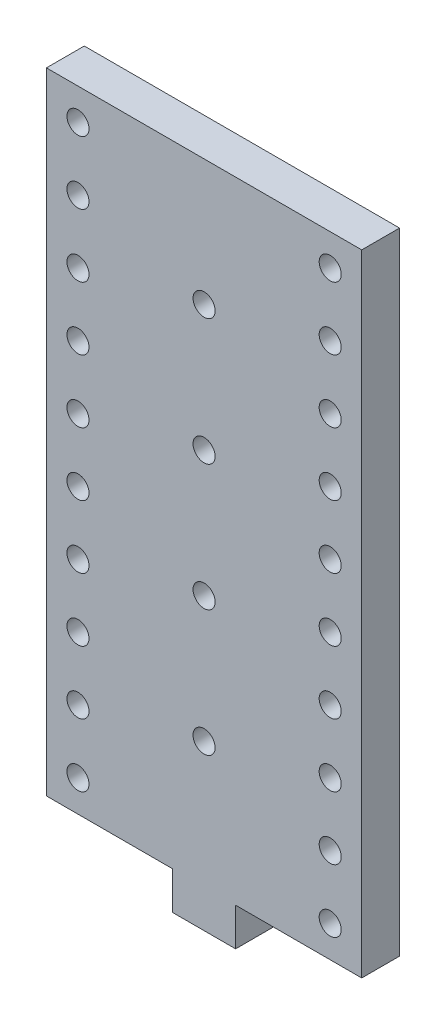
ISO-10303-21;
HEADER;
FILE_DESCRIPTION(('STEP AP214'),'2;1');
FILE_NAME('part.step','',(''),(''),'','','');
FILE_SCHEMA(('AUTOMOTIVE_DESIGN { 1 0 10303 214 1 1 1 1 }'));
ENDSEC;
DATA;
#1=APPLICATION_CONTEXT('core data for automotive mechanical design processes');
#2=APPLICATION_PROTOCOL_DEFINITION('international standard','automotive_design',2000,#1);
#3=PRODUCT_CONTEXT('',#1,'mechanical');
#4=PRODUCT('Part','Part','',(#3));
#5=PRODUCT_RELATED_PRODUCT_CATEGORY('part','',(#4));
#6=PRODUCT_DEFINITION_FORMATION('','',#4);
#7=PRODUCT_DEFINITION_CONTEXT('part definition',#1,'design');
#8=PRODUCT_DEFINITION('design','',#6,#7);
#9=PRODUCT_DEFINITION_SHAPE('','',#8);
#10=(LENGTH_UNIT() NAMED_UNIT(*) SI_UNIT(.MILLI.,.METRE.));
#11=(NAMED_UNIT(*) PLANE_ANGLE_UNIT() SI_UNIT($,.RADIAN.));
#12=(NAMED_UNIT(*) SI_UNIT($,.STERADIAN.) SOLID_ANGLE_UNIT());
#13=UNCERTAINTY_MEASURE_WITH_UNIT(LENGTH_MEASURE(1.E-05),#10,'distance_accuracy_value','');
#14=(GEOMETRIC_REPRESENTATION_CONTEXT(3) GLOBAL_UNCERTAINTY_ASSIGNED_CONTEXT((#13)) GLOBAL_UNIT_ASSIGNED_CONTEXT((#10,
#11,#12)) REPRESENTATION_CONTEXT('',''));
#15=CARTESIAN_POINT('',(0.,0.,0.));
#16=DIRECTION('',(0.,0.,1.));
#17=DIRECTION('',(1.,0.,0.));
#18=AXIS2_PLACEMENT_3D('',#15,#16,#17);
#19=CARTESIAN_POINT('',(20.6383027209334,0.,6.));
#20=DIRECTION('',(0.,1.,0.));
#21=DIRECTION('',(-1.,0.,0.));
#22=AXIS2_PLACEMENT_3D('',#19,#20,#21);
#23=PLANE('',#22);
#24=DIRECTION('',(0.,0.,-1.));
#25=VECTOR('',#24,1.);
#26=CARTESIAN_POINT('',(-9.36169727906661,0.,6.));
#27=LINE('',#26,#25);
#28=CARTESIAN_POINT('',(-9.36169727906661,0.,6.));
#29=VERTEX_POINT('',#28);
#30=CARTESIAN_POINT('',(-9.36169727906661,0.,0.));
#31=VERTEX_POINT('',#30);
#32=EDGE_CURVE('E57',#29,#31,#27,.T.);
#33=ORIENTED_EDGE('',*,*,#32,.F.);
#34=DIRECTION('',(1.,0.,0.));
#35=VECTOR('',#34,1.);
#36=CARTESIAN_POINT('',(20.6383027209334,0.,6.));
#37=LINE('',#36,#35);
#38=CARTESIAN_POINT('',(-29.3616972790666,0.,6.));
#39=VERTEX_POINT('',#38);
#40=EDGE_CURVE('E345',#39,#29,#37,.T.);
#41=ORIENTED_EDGE('',*,*,#40,.F.);
#42=DIRECTION('',(0.,0.,-1.));
#43=VECTOR('',#42,1.);
#44=CARTESIAN_POINT('',(-29.3616972790666,0.,6.));
#45=LINE('',#44,#43);
#46=CARTESIAN_POINT('',(-29.3616972790666,0.,0.));
#47=VERTEX_POINT('',#46);
#48=EDGE_CURVE('E364',#39,#47,#45,.T.);
#49=ORIENTED_EDGE('',*,*,#48,.T.);
#50=DIRECTION('',(1.,0.,0.));
#51=VECTOR('',#50,1.);
#52=CARTESIAN_POINT('',(20.6383027209334,0.,0.));
#53=LINE('',#52,#51);
#54=EDGE_CURVE('E338',#47,#31,#53,.T.);
#55=ORIENTED_EDGE('',*,*,#54,.T.);
#56=EDGE_LOOP('',(#33,#41,#49,#55));
#57=FACE_BOUND('',#56,.T.);
#58=ADVANCED_FACE('F41',(#57),#23,.F.);
#59=DIRECTION('',(0.,0.,1.));
#60=VECTOR('',#59,1.);
#61=CARTESIAN_POINT('',(0.638302720933393,0.,6.));
#62=LINE('',#61,#60);
#63=CARTESIAN_POINT('',(0.638302720933393,0.,0.));
#64=VERTEX_POINT('',#63);
#65=CARTESIAN_POINT('',(0.638302720933393,0.,6.));
#66=VERTEX_POINT('',#65);
#67=EDGE_CURVE('E65',#64,#66,#62,.T.);
#68=ORIENTED_EDGE('',*,*,#67,.F.);
#69=CARTESIAN_POINT('',(20.6383027209334,0.,0.));
#70=VERTEX_POINT('',#69);
#71=EDGE_CURVE('E358',#64,#70,#53,.T.);
#72=ORIENTED_EDGE('',*,*,#71,.T.);
#73=DIRECTION('',(0.,0.,-1.));
#74=VECTOR('',#73,1.);
#75=CARTESIAN_POINT('',(20.6383027209334,0.,6.));
#76=LINE('',#75,#74);
#77=CARTESIAN_POINT('',(20.6383027209334,0.,6.));
#78=VERTEX_POINT('',#77);
#79=EDGE_CURVE('E348',#78,#70,#76,.T.);
#80=ORIENTED_EDGE('',*,*,#79,.F.);
#81=EDGE_CURVE('E344',#66,#78,#37,.T.);
#82=ORIENTED_EDGE('',*,*,#81,.F.);
#83=EDGE_LOOP('',(#68,#72,#80,#82));
#84=FACE_BOUND('',#83,.T.);
#85=ADVANCED_FACE('F398',(#84),#23,.F.);
#86=CARTESIAN_POINT('',(20.6383027209334,0.,6.));
#87=DIRECTION('',(-1.,0.,0.));
#88=DIRECTION('',(0.,0.,1.));
#89=AXIS2_PLACEMENT_3D('',#86,#87,#88);
#90=PLANE('',#89);
#91=DIRECTION('',(0.,1.,0.));
#92=VECTOR('',#91,1.);
#93=CARTESIAN_POINT('',(20.6383027209334,0.,0.));
#94=LINE('',#93,#92);
#95=CARTESIAN_POINT('',(20.6383027209334,100.,0.));
#96=VERTEX_POINT('',#95);
#97=EDGE_CURVE('E332',#70,#96,#94,.T.);
#98=ORIENTED_EDGE('',*,*,#97,.T.);
#99=DIRECTION('',(0.,0.,-1.));
#100=VECTOR('',#99,1.);
#101=CARTESIAN_POINT('',(20.6383027209334,100.,6.));
#102=LINE('',#101,#100);
#103=CARTESIAN_POINT('',(20.6383027209334,100.,6.));
#104=VERTEX_POINT('',#103);
#105=EDGE_CURVE('E11',#104,#96,#102,.T.);
#106=ORIENTED_EDGE('',*,*,#105,.F.);
#107=DIRECTION('',(0.,1.,0.));
#108=VECTOR('',#107,1.);
#109=CARTESIAN_POINT('',(20.6383027209334,0.,6.));
#110=LINE('',#109,#108);
#111=EDGE_CURVE('E333',#78,#104,#110,.T.);
#112=ORIENTED_EDGE('',*,*,#111,.F.);
#113=ORIENTED_EDGE('',*,*,#79,.T.);
#114=EDGE_LOOP('',(#98,#106,#112,#113));
#115=FACE_BOUND('',#114,.T.);
#116=ADVANCED_FACE('F43',(#115),#90,.F.);
#117=CARTESIAN_POINT('',(20.6383027209334,100.,6.));
#118=DIRECTION('',(0.,-1.,0.));
#119=DIRECTION('',(0.,0.,-1.));
#120=AXIS2_PLACEMENT_3D('',#117,#118,#119);
#121=PLANE('',#120);
#122=DIRECTION('',(-1.,0.,0.));
#123=VECTOR('',#122,1.);
#124=CARTESIAN_POINT('',(20.6383027209334,100.,0.));
#125=LINE('',#124,#123);
#126=CARTESIAN_POINT('',(-29.3616972790666,100.,0.));
#127=VERTEX_POINT('',#126);
#128=EDGE_CURVE('E352',#96,#127,#125,.T.);
#129=ORIENTED_EDGE('',*,*,#128,.T.);
#130=DIRECTION('',(0.,0.,-1.));
#131=VECTOR('',#130,1.);
#132=CARTESIAN_POINT('',(-29.3616972790666,100.,6.));
#133=LINE('',#132,#131);
#134=CARTESIAN_POINT('',(-29.3616972790666,100.,6.));
#135=VERTEX_POINT('',#134);
#136=EDGE_CURVE('E50',#135,#127,#133,.T.);
#137=ORIENTED_EDGE('',*,*,#136,.F.);
#138=DIRECTION('',(-1.,0.,0.));
#139=VECTOR('',#138,1.);
#140=CARTESIAN_POINT('',(20.6383027209334,100.,6.));
#141=LINE('',#140,#139);
#142=EDGE_CURVE('E337',#104,#135,#141,.T.);
#143=ORIENTED_EDGE('',*,*,#142,.F.);
#144=ORIENTED_EDGE('',*,*,#105,.T.);
#145=EDGE_LOOP('',(#129,#137,#143,#144));
#146=FACE_BOUND('',#145,.T.);
#147=ADVANCED_FACE('F400',(#146),#121,.F.);
#148=CARTESIAN_POINT('',(-29.3616972790666,0.,6.));
#149=DIRECTION('',(1.,0.,0.));
#150=DIRECTION('',(0.,0.,-1.));
#151=AXIS2_PLACEMENT_3D('',#148,#149,#150);
#152=PLANE('',#151);
#153=DIRECTION('',(0.,-1.,0.));
#154=VECTOR('',#153,1.);
#155=CARTESIAN_POINT('',(-29.3616972790666,0.,0.));
#156=LINE('',#155,#154);
#157=EDGE_CURVE('E355',#127,#47,#156,.T.);
#158=ORIENTED_EDGE('',*,*,#157,.T.);
#159=ORIENTED_EDGE('',*,*,#48,.F.);
#160=DIRECTION('',(0.,-1.,0.));
#161=VECTOR('',#160,1.);
#162=CARTESIAN_POINT('',(-29.3616972790666,0.,6.));
#163=LINE('',#162,#161);
#164=EDGE_CURVE('E341',#135,#39,#163,.T.);
#165=ORIENTED_EDGE('',*,*,#164,.F.);
#166=ORIENTED_EDGE('',*,*,#136,.T.);
#167=EDGE_LOOP('',(#158,#159,#165,#166));
#168=FACE_BOUND('',#167,.T.);
#169=ADVANCED_FACE('F373',(#168),#152,.F.);
#170=CARTESIAN_POINT('',(0.,0.,6.));
#171=DIRECTION('',(0.,0.,1.));
#172=DIRECTION('',(1.,0.,0.));
#173=AXIS2_PLACEMENT_3D('',#170,#171,#172);
#174=PLANE('',#173);
#175=CARTESIAN_POINT('',(-4.3616972790666,20.,6.));
#176=DIRECTION('',(0.,0.,1.));
#177=DIRECTION('',(1.,0.,0.));
#178=AXIS2_PLACEMENT_3D('',#175,#176,#177);
#179=CIRCLE('',#178,1.75);
#180=CARTESIAN_POINT('',(-2.6116972790666,20.,6.));
#181=VERTEX_POINT('',#180);
#182=EDGE_CURVE('E134',#181,#181,#179,.T.);
#183=ORIENTED_EDGE('',*,*,#182,.F.);
#184=EDGE_LOOP('',(#183));
#185=FACE_BOUND('',#184,.T.);
#186=CARTESIAN_POINT('',(-4.3616972790666,60.,6.));
#187=DIRECTION('',(0.,0.,1.));
#188=DIRECTION('',(1.,0.,0.));
#189=AXIS2_PLACEMENT_3D('',#186,#187,#188);
#190=CIRCLE('',#189,1.75);
#191=CARTESIAN_POINT('',(-2.6116972790666,60.,6.));
#192=VERTEX_POINT('',#191);
#193=EDGE_CURVE('E158',#192,#192,#190,.T.);
#194=ORIENTED_EDGE('',*,*,#193,.F.);
#195=EDGE_LOOP('',(#194));
#196=FACE_BOUND('',#195,.T.);
#197=CARTESIAN_POINT('',(-4.3616972790666,80.,6.));
#198=DIRECTION('',(0.,0.,1.));
#199=DIRECTION('',(1.,0.,0.));
#200=AXIS2_PLACEMENT_3D('',#197,#198,#199);
#201=CIRCLE('',#200,1.75);
#202=CARTESIAN_POINT('',(-2.6116972790666,80.,6.));
#203=VERTEX_POINT('',#202);
#204=EDGE_CURVE('E150',#203,#203,#201,.T.);
#205=ORIENTED_EDGE('',*,*,#204,.F.);
#206=EDGE_LOOP('',(#205));
#207=FACE_BOUND('',#206,.T.);
#208=CARTESIAN_POINT('',(-4.3616972790666,40.,6.));
#209=DIRECTION('',(0.,0.,1.));
#210=DIRECTION('',(1.,0.,0.));
#211=AXIS2_PLACEMENT_3D('',#208,#209,#210);
#212=CIRCLE('',#211,1.75);
#213=CARTESIAN_POINT('',(-2.6116972790666,40.,6.));
#214=VERTEX_POINT('',#213);
#215=EDGE_CURVE('E149',#214,#214,#212,.T.);
#216=ORIENTED_EDGE('',*,*,#215,.F.);
#217=EDGE_LOOP('',(#216));
#218=FACE_BOUND('',#217,.T.);
#219=CARTESIAN_POINT('',(15.6383027209334,75.,6.));
#220=DIRECTION('',(0.,0.,1.));
#221=DIRECTION('',(1.,0.,0.));
#222=AXIS2_PLACEMENT_3D('',#219,#220,#221);
#223=CIRCLE('',#222,1.75);
#224=CARTESIAN_POINT('',(17.3883027209334,75.,6.));
#225=VERTEX_POINT('',#224);
#226=EDGE_CURVE('E328',#225,#225,#223,.T.);
#227=ORIENTED_EDGE('',*,*,#226,.F.);
#228=EDGE_LOOP('',(#227));
#229=FACE_BOUND('',#228,.T.);
#230=CARTESIAN_POINT('',(15.6383027209334,85.,6.));
#231=DIRECTION('',(0.,0.,1.));
#232=DIRECTION('',(1.,0.,0.));
#233=AXIS2_PLACEMENT_3D('',#230,#231,#232);
#234=CIRCLE('',#233,1.75);
#235=CARTESIAN_POINT('',(17.3883027209334,85.,6.));
#236=VERTEX_POINT('',#235);
#237=EDGE_CURVE('E324',#236,#236,#234,.T.);
#238=ORIENTED_EDGE('',*,*,#237,.F.);
#239=EDGE_LOOP('',(#238));
#240=FACE_BOUND('',#239,.T.);
#241=CARTESIAN_POINT('',(15.6383027209334,95.,6.));
#242=DIRECTION('',(0.,0.,1.));
#243=DIRECTION('',(1.,0.,0.));
#244=AXIS2_PLACEMENT_3D('',#241,#242,#243);
#245=CIRCLE('',#244,1.75);
#246=CARTESIAN_POINT('',(17.3883027209334,95.,6.));
#247=VERTEX_POINT('',#246);
#248=EDGE_CURVE('E320',#247,#247,#245,.T.);
#249=ORIENTED_EDGE('',*,*,#248,.F.);
#250=EDGE_LOOP('',(#249));
#251=FACE_BOUND('',#250,.T.);
#252=CARTESIAN_POINT('',(-24.3616972790666,4.99999999999999,6.));
#253=DIRECTION('',(0.,0.,1.));
#254=DIRECTION('',(1.,0.,0.));
#255=AXIS2_PLACEMENT_3D('',#252,#253,#254);
#256=CIRCLE('',#255,1.75);
#257=CARTESIAN_POINT('',(-22.6116972790666,4.99999999999999,6.));
#258=VERTEX_POINT('',#257);
#259=EDGE_CURVE('E316',#258,#258,#256,.T.);
#260=ORIENTED_EDGE('',*,*,#259,.F.);
#261=EDGE_LOOP('',(#260));
#262=FACE_BOUND('',#261,.T.);
#263=CARTESIAN_POINT('',(15.6383027209334,65.,6.));
#264=DIRECTION('',(0.,0.,1.));
#265=DIRECTION('',(1.,0.,0.));
#266=AXIS2_PLACEMENT_3D('',#263,#264,#265);
#267=CIRCLE('',#266,1.75);
#268=CARTESIAN_POINT('',(17.3883027209334,65.,6.));
#269=VERTEX_POINT('',#268);
#270=EDGE_CURVE('E312',#269,#269,#267,.T.);
#271=ORIENTED_EDGE('',*,*,#270,.F.);
#272=EDGE_LOOP('',(#271));
#273=FACE_BOUND('',#272,.T.);
#274=CARTESIAN_POINT('',(15.6383027209334,55.,6.));
#275=DIRECTION('',(0.,0.,1.));
#276=DIRECTION('',(1.,0.,0.));
#277=AXIS2_PLACEMENT_3D('',#274,#275,#276);
#278=CIRCLE('',#277,1.75);
#279=CARTESIAN_POINT('',(17.3883027209334,55.,6.));
#280=VERTEX_POINT('',#279);
#281=EDGE_CURVE('E308',#280,#280,#278,.T.);
#282=ORIENTED_EDGE('',*,*,#281,.F.);
#283=EDGE_LOOP('',(#282));
#284=FACE_BOUND('',#283,.T.);
#285=CARTESIAN_POINT('',(15.6383027209334,45.,6.));
#286=DIRECTION('',(0.,0.,1.));
#287=DIRECTION('',(1.,0.,0.));
#288=AXIS2_PLACEMENT_3D('',#285,#286,#287);
#289=CIRCLE('',#288,1.75);
#290=CARTESIAN_POINT('',(17.3883027209334,45.,6.));
#291=VERTEX_POINT('',#290);
#292=EDGE_CURVE('E304',#291,#291,#289,.T.);
#293=ORIENTED_EDGE('',*,*,#292,.F.);
#294=EDGE_LOOP('',(#293));
#295=FACE_BOUND('',#294,.T.);
#296=CARTESIAN_POINT('',(15.6383027209334,35.,6.));
#297=DIRECTION('',(0.,0.,1.));
#298=DIRECTION('',(1.,0.,0.));
#299=AXIS2_PLACEMENT_3D('',#296,#297,#298);
#300=CIRCLE('',#299,1.75);
#301=CARTESIAN_POINT('',(17.3883027209334,35.,6.));
#302=VERTEX_POINT('',#301);
#303=EDGE_CURVE('E300',#302,#302,#300,.T.);
#304=ORIENTED_EDGE('',*,*,#303,.F.);
#305=EDGE_LOOP('',(#304));
#306=FACE_BOUND('',#305,.T.);
#307=CARTESIAN_POINT('',(-24.3616972790666,15.,6.));
#308=DIRECTION('',(0.,0.,1.));
#309=DIRECTION('',(1.,0.,0.));
#310=AXIS2_PLACEMENT_3D('',#307,#308,#309);
#311=CIRCLE('',#310,1.75);
#312=CARTESIAN_POINT('',(-22.6116972790666,15.,6.));
#313=VERTEX_POINT('',#312);
#314=EDGE_CURVE('E296',#313,#313,#311,.T.);
#315=ORIENTED_EDGE('',*,*,#314,.F.);
#316=EDGE_LOOP('',(#315));
#317=FACE_BOUND('',#316,.T.);
#318=CARTESIAN_POINT('',(-24.3616972790666,25.,6.));
#319=DIRECTION('',(0.,0.,1.));
#320=DIRECTION('',(1.,0.,0.));
#321=AXIS2_PLACEMENT_3D('',#318,#319,#320);
#322=CIRCLE('',#321,1.75);
#323=CARTESIAN_POINT('',(-22.6116972790666,25.,6.));
#324=VERTEX_POINT('',#323);
#325=EDGE_CURVE('E292',#324,#324,#322,.T.);
#326=ORIENTED_EDGE('',*,*,#325,.F.);
#327=EDGE_LOOP('',(#326));
#328=FACE_BOUND('',#327,.T.);
#329=CARTESIAN_POINT('',(-24.3616972790666,35.,6.));
#330=DIRECTION('',(0.,0.,1.));
#331=DIRECTION('',(1.,0.,0.));
#332=AXIS2_PLACEMENT_3D('',#329,#330,#331);
#333=CIRCLE('',#332,1.75);
#334=CARTESIAN_POINT('',(-22.6116972790666,35.,6.));
#335=VERTEX_POINT('',#334);
#336=EDGE_CURVE('E288',#335,#335,#333,.T.);
#337=ORIENTED_EDGE('',*,*,#336,.F.);
#338=EDGE_LOOP('',(#337));
#339=FACE_BOUND('',#338,.T.);
#340=CARTESIAN_POINT('',(-24.3616972790666,45.,6.));
#341=DIRECTION('',(0.,0.,1.));
#342=DIRECTION('',(1.,0.,0.));
#343=AXIS2_PLACEMENT_3D('',#340,#341,#342);
#344=CIRCLE('',#343,1.75);
#345=CARTESIAN_POINT('',(-22.6116972790666,45.,6.));
#346=VERTEX_POINT('',#345);
#347=EDGE_CURVE('E284',#346,#346,#344,.T.);
#348=ORIENTED_EDGE('',*,*,#347,.F.);
#349=EDGE_LOOP('',(#348));
#350=FACE_BOUND('',#349,.T.);
#351=CARTESIAN_POINT('',(-24.3616972790666,55.,6.));
#352=DIRECTION('',(0.,0.,1.));
#353=DIRECTION('',(1.,0.,0.));
#354=AXIS2_PLACEMENT_3D('',#351,#352,#353);
#355=CIRCLE('',#354,1.75);
#356=CARTESIAN_POINT('',(-22.6116972790666,55.,6.));
#357=VERTEX_POINT('',#356);
#358=EDGE_CURVE('E280',#357,#357,#355,.T.);
#359=ORIENTED_EDGE('',*,*,#358,.F.);
#360=EDGE_LOOP('',(#359));
#361=FACE_BOUND('',#360,.T.);
#362=CARTESIAN_POINT('',(-24.3616972790666,65.,6.));
#363=DIRECTION('',(0.,0.,1.));
#364=DIRECTION('',(1.,0.,0.));
#365=AXIS2_PLACEMENT_3D('',#362,#363,#364);
#366=CIRCLE('',#365,1.75);
#367=CARTESIAN_POINT('',(-22.6116972790666,65.,6.));
#368=VERTEX_POINT('',#367);
#369=EDGE_CURVE('E276',#368,#368,#366,.T.);
#370=ORIENTED_EDGE('',*,*,#369,.F.);
#371=EDGE_LOOP('',(#370));
#372=FACE_BOUND('',#371,.T.);
#373=CARTESIAN_POINT('',(-24.3616972790666,75.,6.));
#374=DIRECTION('',(0.,0.,1.));
#375=DIRECTION('',(1.,0.,0.));
#376=AXIS2_PLACEMENT_3D('',#373,#374,#375);
#377=CIRCLE('',#376,1.75);
#378=CARTESIAN_POINT('',(-22.6116972790666,75.,6.));
#379=VERTEX_POINT('',#378);
#380=EDGE_CURVE('E272',#379,#379,#377,.T.);
#381=ORIENTED_EDGE('',*,*,#380,.F.);
#382=EDGE_LOOP('',(#381));
#383=FACE_BOUND('',#382,.T.);
#384=CARTESIAN_POINT('',(-24.3616972790666,85.,6.));
#385=DIRECTION('',(0.,0.,1.));
#386=DIRECTION('',(1.,0.,0.));
#387=AXIS2_PLACEMENT_3D('',#384,#385,#386);
#388=CIRCLE('',#387,1.75);
#389=CARTESIAN_POINT('',(-22.6116972790666,85.,6.));
#390=VERTEX_POINT('',#389);
#391=EDGE_CURVE('E268',#390,#390,#388,.T.);
#392=ORIENTED_EDGE('',*,*,#391,.F.);
#393=EDGE_LOOP('',(#392));
#394=FACE_BOUND('',#393,.T.);
#395=CARTESIAN_POINT('',(15.6383027209334,25.,6.));
#396=DIRECTION('',(0.,0.,1.));
#397=DIRECTION('',(1.,0.,0.));
#398=AXIS2_PLACEMENT_3D('',#395,#396,#397);
#399=CIRCLE('',#398,1.75);
#400=CARTESIAN_POINT('',(17.3883027209334,25.,6.));
#401=VERTEX_POINT('',#400);
#402=EDGE_CURVE('E264',#401,#401,#399,.T.);
#403=ORIENTED_EDGE('',*,*,#402,.F.);
#404=EDGE_LOOP('',(#403));
#405=FACE_BOUND('',#404,.T.);
#406=CARTESIAN_POINT('',(15.6383027209334,15.,6.));
#407=DIRECTION('',(0.,0.,1.));
#408=DIRECTION('',(1.,0.,0.));
#409=AXIS2_PLACEMENT_3D('',#406,#407,#408);
#410=CIRCLE('',#409,1.75);
#411=CARTESIAN_POINT('',(17.3883027209334,15.,6.));
#412=VERTEX_POINT('',#411);
#413=EDGE_CURVE('E260',#412,#412,#410,.T.);
#414=ORIENTED_EDGE('',*,*,#413,.F.);
#415=EDGE_LOOP('',(#414));
#416=FACE_BOUND('',#415,.T.);
#417=CARTESIAN_POINT('',(15.6383027209334,4.99999999999999,6.));
#418=DIRECTION('',(0.,0.,1.));
#419=DIRECTION('',(1.,0.,0.));
#420=AXIS2_PLACEMENT_3D('',#417,#418,#419);
#421=CIRCLE('',#420,1.75);
#422=CARTESIAN_POINT('',(17.3883027209334,4.99999999999999,6.));
#423=VERTEX_POINT('',#422);
#424=EDGE_CURVE('E256',#423,#423,#421,.T.);
#425=ORIENTED_EDGE('',*,*,#424,.F.);
#426=EDGE_LOOP('',(#425));
#427=FACE_BOUND('',#426,.T.);
#428=CARTESIAN_POINT('',(-24.3616972790666,95.,6.));
#429=DIRECTION('',(0.,0.,1.));
#430=DIRECTION('',(1.,0.,0.));
#431=AXIS2_PLACEMENT_3D('',#428,#429,#430);
#432=CIRCLE('',#431,1.75);
#433=CARTESIAN_POINT('',(-22.6116972790666,95.,6.));
#434=VERTEX_POINT('',#433);
#435=EDGE_CURVE('E252',#434,#434,#432,.T.);
#436=ORIENTED_EDGE('',*,*,#435,.F.);
#437=EDGE_LOOP('',(#436));
#438=FACE_BOUND('',#437,.T.);
#439=ORIENTED_EDGE('',*,*,#111,.T.);
#440=ORIENTED_EDGE('',*,*,#142,.T.);
#441=ORIENTED_EDGE('',*,*,#164,.T.);
#442=ORIENTED_EDGE('',*,*,#40,.T.);
#443=DIRECTION('',(0.,1.,0.));
#444=VECTOR('',#443,1.);
#445=CARTESIAN_POINT('',(-9.36169727906661,-6.,6.));
#446=LINE('',#445,#444);
#447=CARTESIAN_POINT('',(-9.36169727906661,-6.,6.));
#448=VERTEX_POINT('',#447);
#449=EDGE_CURVE('E378',#448,#29,#446,.T.);
#450=ORIENTED_EDGE('',*,*,#449,.F.);
#451=DIRECTION('',(-1.,0.,0.));
#452=VECTOR('',#451,1.);
#453=CARTESIAN_POINT('',(-9.36169727906661,-6.,6.));
#454=LINE('',#453,#452);
#455=CARTESIAN_POINT('',(0.638302720933394,-6.,6.));
#456=VERTEX_POINT('',#455);
#457=EDGE_CURVE('E126',#456,#448,#454,.T.);
#458=ORIENTED_EDGE('',*,*,#457,.F.);
#459=DIRECTION('',(0.,1.,0.));
#460=VECTOR('',#459,1.);
#461=CARTESIAN_POINT('',(0.638302720933394,-6.,6.));
#462=LINE('',#461,#460);
#463=EDGE_CURVE('E141',#456,#66,#462,.T.);
#464=ORIENTED_EDGE('',*,*,#463,.T.);
#465=ORIENTED_EDGE('',*,*,#81,.T.);
#466=EDGE_LOOP('',(#439,#440,#441,#442,#450,#458,#464,#465));
#467=FACE_BOUND('',#466,.T.);
#468=ADVANCED_FACE('F377',(#185,#196,#207,#218,#229,#240,#251,#262,#273,#284,#295,#306,#317,
#328,#339,#350,#361,#372,#383,#394,#405,#416,#427,#438,#467),#174,.T.);
#469=CARTESIAN_POINT('',(0.,0.,0.));
#470=DIRECTION('',(0.,0.,1.));
#471=DIRECTION('',(1.,0.,0.));
#472=AXIS2_PLACEMENT_3D('',#469,#470,#471);
#473=PLANE('',#472);
#474=CARTESIAN_POINT('',(-4.3616972790666,20.,0.));
#475=DIRECTION('',(0.,0.,1.));
#476=DIRECTION('',(1.,0.,0.));
#477=AXIS2_PLACEMENT_3D('',#474,#475,#476);
#478=CIRCLE('',#477,1.75);
#479=CARTESIAN_POINT('',(-2.6116972790666,20.,0.));
#480=VERTEX_POINT('',#479);
#481=EDGE_CURVE('E139',#480,#480,#478,.T.);
#482=ORIENTED_EDGE('',*,*,#481,.T.);
#483=EDGE_LOOP('',(#482));
#484=FACE_BOUND('',#483,.T.);
#485=CARTESIAN_POINT('',(-4.3616972790666,60.,0.));
#486=DIRECTION('',(0.,0.,1.));
#487=DIRECTION('',(1.,0.,0.));
#488=AXIS2_PLACEMENT_3D('',#485,#486,#487);
#489=CIRCLE('',#488,1.75);
#490=CARTESIAN_POINT('',(-2.6116972790666,60.,0.));
#491=VERTEX_POINT('',#490);
#492=EDGE_CURVE('E154',#491,#491,#489,.T.);
#493=ORIENTED_EDGE('',*,*,#492,.T.);
#494=EDGE_LOOP('',(#493));
#495=FACE_BOUND('',#494,.T.);
#496=CARTESIAN_POINT('',(-4.3616972790666,80.,0.));
#497=DIRECTION('',(0.,0.,1.));
#498=DIRECTION('',(1.,0.,0.));
#499=AXIS2_PLACEMENT_3D('',#496,#497,#498);
#500=CIRCLE('',#499,1.75);
#501=CARTESIAN_POINT('',(-2.6116972790666,80.,0.));
#502=VERTEX_POINT('',#501);
#503=EDGE_CURVE('E145',#502,#502,#500,.T.);
#504=ORIENTED_EDGE('',*,*,#503,.T.);
#505=EDGE_LOOP('',(#504));
#506=FACE_BOUND('',#505,.T.);
#507=CARTESIAN_POINT('',(-4.3616972790666,40.,0.));
#508=DIRECTION('',(0.,0.,1.));
#509=DIRECTION('',(1.,0.,0.));
#510=AXIS2_PLACEMENT_3D('',#507,#508,#509);
#511=CIRCLE('',#510,1.75);
#512=CARTESIAN_POINT('',(-2.6116972790666,40.,0.));
#513=VERTEX_POINT('',#512);
#514=EDGE_CURVE('E165',#513,#513,#511,.T.);
#515=ORIENTED_EDGE('',*,*,#514,.T.);
#516=EDGE_LOOP('',(#515));
#517=FACE_BOUND('',#516,.T.);
#518=CARTESIAN_POINT('',(15.6383027209334,75.,0.));
#519=DIRECTION('',(0.,0.,1.));
#520=DIRECTION('',(1.,0.,0.));
#521=AXIS2_PLACEMENT_3D('',#518,#519,#520);
#522=CIRCLE('',#521,1.75);
#523=CARTESIAN_POINT('',(17.3883027209334,75.,0.));
#524=VERTEX_POINT('',#523);
#525=EDGE_CURVE('E189',#524,#524,#522,.T.);
#526=ORIENTED_EDGE('',*,*,#525,.T.);
#527=EDGE_LOOP('',(#526));
#528=FACE_BOUND('',#527,.T.);
#529=CARTESIAN_POINT('',(15.6383027209334,85.,0.));
#530=DIRECTION('',(0.,0.,1.));
#531=DIRECTION('',(1.,0.,0.));
#532=AXIS2_PLACEMENT_3D('',#529,#530,#531);
#533=CIRCLE('',#532,1.75);
#534=CARTESIAN_POINT('',(17.3883027209334,85.,0.));
#535=VERTEX_POINT('',#534);
#536=EDGE_CURVE('E201',#535,#535,#533,.T.);
#537=ORIENTED_EDGE('',*,*,#536,.T.);
#538=EDGE_LOOP('',(#537));
#539=FACE_BOUND('',#538,.T.);
#540=CARTESIAN_POINT('',(15.6383027209334,95.,0.));
#541=DIRECTION('',(0.,0.,1.));
#542=DIRECTION('',(1.,0.,0.));
#543=AXIS2_PLACEMENT_3D('',#540,#541,#542);
#544=CIRCLE('',#543,1.75);
#545=CARTESIAN_POINT('',(17.3883027209334,95.,0.));
#546=VERTEX_POINT('',#545);
#547=EDGE_CURVE('E205',#546,#546,#544,.T.);
#548=ORIENTED_EDGE('',*,*,#547,.T.);
#549=EDGE_LOOP('',(#548));
#550=FACE_BOUND('',#549,.T.);
#551=CARTESIAN_POINT('',(-24.3616972790666,4.99999999999999,0.));
#552=DIRECTION('',(0.,0.,1.));
#553=DIRECTION('',(1.,0.,0.));
#554=AXIS2_PLACEMENT_3D('',#551,#552,#553);
#555=CIRCLE('',#554,1.75);
#556=CARTESIAN_POINT('',(-22.6116972790666,4.99999999999999,0.));
#557=VERTEX_POINT('',#556);
#558=EDGE_CURVE('E209',#557,#557,#555,.T.);
#559=ORIENTED_EDGE('',*,*,#558,.T.);
#560=EDGE_LOOP('',(#559));
#561=FACE_BOUND('',#560,.T.);
#562=CARTESIAN_POINT('',(15.6383027209334,65.,0.));
#563=DIRECTION('',(0.,0.,1.));
#564=DIRECTION('',(1.,0.,0.));
#565=AXIS2_PLACEMENT_3D('',#562,#563,#564);
#566=CIRCLE('',#565,1.75);
#567=CARTESIAN_POINT('',(17.3883027209334,65.,0.));
#568=VERTEX_POINT('',#567);
#569=EDGE_CURVE('E185',#568,#568,#566,.T.);
#570=ORIENTED_EDGE('',*,*,#569,.T.);
#571=EDGE_LOOP('',(#570));
#572=FACE_BOUND('',#571,.T.);
#573=CARTESIAN_POINT('',(15.6383027209334,55.,0.));
#574=DIRECTION('',(0.,0.,1.));
#575=DIRECTION('',(1.,0.,0.));
#576=AXIS2_PLACEMENT_3D('',#573,#574,#575);
#577=CIRCLE('',#576,1.75);
#578=CARTESIAN_POINT('',(17.3883027209334,55.,0.));
#579=VERTEX_POINT('',#578);
#580=EDGE_CURVE('E190',#579,#579,#577,.T.);
#581=ORIENTED_EDGE('',*,*,#580,.T.);
#582=EDGE_LOOP('',(#581));
#583=FACE_BOUND('',#582,.T.);
#584=CARTESIAN_POINT('',(15.6383027209334,45.,0.));
#585=DIRECTION('',(0.,0.,1.));
#586=DIRECTION('',(1.,0.,0.));
#587=AXIS2_PLACEMENT_3D('',#584,#585,#586);
#588=CIRCLE('',#587,1.75);
#589=CARTESIAN_POINT('',(17.3883027209334,45.,0.));
#590=VERTEX_POINT('',#589);
#591=EDGE_CURVE('E194',#590,#590,#588,.T.);
#592=ORIENTED_EDGE('',*,*,#591,.T.);
#593=EDGE_LOOP('',(#592));
#594=FACE_BOUND('',#593,.T.);
#595=CARTESIAN_POINT('',(15.6383027209334,35.,0.));
#596=DIRECTION('',(0.,0.,1.));
#597=DIRECTION('',(1.,0.,0.));
#598=AXIS2_PLACEMENT_3D('',#595,#596,#597);
#599=CIRCLE('',#598,1.75);
#600=CARTESIAN_POINT('',(17.3883027209334,35.,0.));
#601=VERTEX_POINT('',#600);
#602=EDGE_CURVE('E177',#601,#601,#599,.T.);
#603=ORIENTED_EDGE('',*,*,#602,.T.);
#604=EDGE_LOOP('',(#603));
#605=FACE_BOUND('',#604,.T.);
#606=CARTESIAN_POINT('',(-24.3616972790666,15.,0.));
#607=DIRECTION('',(0.,0.,1.));
#608=DIRECTION('',(1.,0.,0.));
#609=AXIS2_PLACEMENT_3D('',#606,#607,#608);
#610=CIRCLE('',#609,1.75);
#611=CARTESIAN_POINT('',(-22.6116972790666,15.,0.));
#612=VERTEX_POINT('',#611);
#613=EDGE_CURVE('E213',#612,#612,#610,.T.);
#614=ORIENTED_EDGE('',*,*,#613,.T.);
#615=EDGE_LOOP('',(#614));
#616=FACE_BOUND('',#615,.T.);
#617=CARTESIAN_POINT('',(-24.3616972790666,25.,0.));
#618=DIRECTION('',(0.,0.,1.));
#619=DIRECTION('',(1.,0.,0.));
#620=AXIS2_PLACEMENT_3D('',#617,#618,#619);
#621=CIRCLE('',#620,1.75);
#622=CARTESIAN_POINT('',(-22.6116972790666,25.,0.));
#623=VERTEX_POINT('',#622);
#624=EDGE_CURVE('E242',#623,#623,#621,.T.);
#625=ORIENTED_EDGE('',*,*,#624,.T.);
#626=EDGE_LOOP('',(#625));
#627=FACE_BOUND('',#626,.T.);
#628=CARTESIAN_POINT('',(-24.3616972790666,35.,0.));
#629=DIRECTION('',(0.,0.,1.));
#630=DIRECTION('',(1.,0.,0.));
#631=AXIS2_PLACEMENT_3D('',#628,#629,#630);
#632=CIRCLE('',#631,1.75);
#633=CARTESIAN_POINT('',(-22.6116972790666,35.,0.));
#634=VERTEX_POINT('',#633);
#635=EDGE_CURVE('E238',#634,#634,#632,.T.);
#636=ORIENTED_EDGE('',*,*,#635,.T.);
#637=EDGE_LOOP('',(#636));
#638=FACE_BOUND('',#637,.T.);
#639=CARTESIAN_POINT('',(-24.3616972790666,45.,0.));
#640=DIRECTION('',(0.,0.,1.));
#641=DIRECTION('',(1.,0.,0.));
#642=AXIS2_PLACEMENT_3D('',#639,#640,#641);
#643=CIRCLE('',#642,1.75);
#644=CARTESIAN_POINT('',(-22.6116972790666,45.,0.));
#645=VERTEX_POINT('',#644);
#646=EDGE_CURVE('E234',#645,#645,#643,.T.);
#647=ORIENTED_EDGE('',*,*,#646,.T.);
#648=EDGE_LOOP('',(#647));
#649=FACE_BOUND('',#648,.T.);
#650=CARTESIAN_POINT('',(-24.3616972790666,55.,0.));
#651=DIRECTION('',(0.,0.,1.));
#652=DIRECTION('',(1.,0.,0.));
#653=AXIS2_PLACEMENT_3D('',#650,#651,#652);
#654=CIRCLE('',#653,1.75);
#655=CARTESIAN_POINT('',(-22.6116972790666,55.,0.));
#656=VERTEX_POINT('',#655);
#657=EDGE_CURVE('E230',#656,#656,#654,.T.);
#658=ORIENTED_EDGE('',*,*,#657,.T.);
#659=EDGE_LOOP('',(#658));
#660=FACE_BOUND('',#659,.T.);
#661=CARTESIAN_POINT('',(-24.3616972790666,65.,0.));
#662=DIRECTION('',(0.,0.,1.));
#663=DIRECTION('',(1.,0.,0.));
#664=AXIS2_PLACEMENT_3D('',#661,#662,#663);
#665=CIRCLE('',#664,1.75);
#666=CARTESIAN_POINT('',(-22.6116972790666,65.,0.));
#667=VERTEX_POINT('',#666);
#668=EDGE_CURVE('E226',#667,#667,#665,.T.);
#669=ORIENTED_EDGE('',*,*,#668,.T.);
#670=EDGE_LOOP('',(#669));
#671=FACE_BOUND('',#670,.T.);
#672=CARTESIAN_POINT('',(-24.3616972790666,75.,0.));
#673=DIRECTION('',(0.,0.,1.));
#674=DIRECTION('',(1.,0.,0.));
#675=AXIS2_PLACEMENT_3D('',#672,#673,#674);
#676=CIRCLE('',#675,1.75);
#677=CARTESIAN_POINT('',(-22.6116972790666,75.,0.));
#678=VERTEX_POINT('',#677);
#679=EDGE_CURVE('E222',#678,#678,#676,.T.);
#680=ORIENTED_EDGE('',*,*,#679,.T.);
#681=EDGE_LOOP('',(#680));
#682=FACE_BOUND('',#681,.T.);
#683=CARTESIAN_POINT('',(-24.3616972790666,85.,0.));
#684=DIRECTION('',(0.,0.,1.));
#685=DIRECTION('',(1.,0.,0.));
#686=AXIS2_PLACEMENT_3D('',#683,#684,#685);
#687=CIRCLE('',#686,1.75);
#688=CARTESIAN_POINT('',(-22.6116972790666,85.,0.));
#689=VERTEX_POINT('',#688);
#690=EDGE_CURVE('E217',#689,#689,#687,.T.);
#691=ORIENTED_EDGE('',*,*,#690,.T.);
#692=EDGE_LOOP('',(#691));
#693=FACE_BOUND('',#692,.T.);
#694=CARTESIAN_POINT('',(15.6383027209334,25.,0.));
#695=DIRECTION('',(0.,0.,1.));
#696=DIRECTION('',(1.,0.,0.));
#697=AXIS2_PLACEMENT_3D('',#694,#695,#696);
#698=CIRCLE('',#697,1.75);
#699=CARTESIAN_POINT('',(17.3883027209334,25.,0.));
#700=VERTEX_POINT('',#699);
#701=EDGE_CURVE('E173',#700,#700,#698,.T.);
#702=ORIENTED_EDGE('',*,*,#701,.T.);
#703=EDGE_LOOP('',(#702));
#704=FACE_BOUND('',#703,.T.);
#705=CARTESIAN_POINT('',(15.6383027209334,15.,0.));
#706=DIRECTION('',(0.,0.,1.));
#707=DIRECTION('',(1.,0.,0.));
#708=AXIS2_PLACEMENT_3D('',#705,#706,#707);
#709=CIRCLE('',#708,1.75);
#710=CARTESIAN_POINT('',(17.3883027209334,15.,0.));
#711=VERTEX_POINT('',#710);
#712=EDGE_CURVE('E178',#711,#711,#709,.T.);
#713=ORIENTED_EDGE('',*,*,#712,.T.);
#714=EDGE_LOOP('',(#713));
#715=FACE_BOUND('',#714,.T.);
#716=CARTESIAN_POINT('',(15.6383027209334,4.99999999999999,0.));
#717=DIRECTION('',(0.,0.,1.));
#718=DIRECTION('',(1.,0.,0.));
#719=AXIS2_PLACEMENT_3D('',#716,#717,#718);
#720=CIRCLE('',#719,1.75);
#721=CARTESIAN_POINT('',(17.3883027209334,4.99999999999999,0.));
#722=VERTEX_POINT('',#721);
#723=EDGE_CURVE('E169',#722,#722,#720,.T.);
#724=ORIENTED_EDGE('',*,*,#723,.T.);
#725=EDGE_LOOP('',(#724));
#726=FACE_BOUND('',#725,.T.);
#727=CARTESIAN_POINT('',(-24.3616972790666,95.,0.));
#728=DIRECTION('',(0.,0.,1.));
#729=DIRECTION('',(1.,0.,0.));
#730=AXIS2_PLACEMENT_3D('',#727,#728,#729);
#731=CIRCLE('',#730,1.75);
#732=CARTESIAN_POINT('',(-22.6116972790666,95.,0.));
#733=VERTEX_POINT('',#732);
#734=EDGE_CURVE('E221',#733,#733,#731,.T.);
#735=ORIENTED_EDGE('',*,*,#734,.T.);
#736=EDGE_LOOP('',(#735));
#737=FACE_BOUND('',#736,.T.);
#738=ORIENTED_EDGE('',*,*,#97,.F.);
#739=ORIENTED_EDGE('',*,*,#71,.F.);
#740=DIRECTION('',(0.,1.,0.));
#741=VECTOR('',#740,1.);
#742=CARTESIAN_POINT('',(0.638302720933394,-6.,0.));
#743=LINE('',#742,#741);
#744=CARTESIAN_POINT('',(0.638302720933394,-6.,0.));
#745=VERTEX_POINT('',#744);
#746=EDGE_CURVE('E116',#745,#64,#743,.T.);
#747=ORIENTED_EDGE('',*,*,#746,.F.);
#748=DIRECTION('',(1.,0.,0.));
#749=VECTOR('',#748,1.);
#750=CARTESIAN_POINT('',(-9.36169727906661,-6.,0.));
#751=LINE('',#750,#749);
#752=CARTESIAN_POINT('',(-9.36169727906661,-6.,0.));
#753=VERTEX_POINT('',#752);
#754=EDGE_CURVE('E108',#753,#745,#751,.T.);
#755=ORIENTED_EDGE('',*,*,#754,.F.);
#756=DIRECTION('',(0.,1.,0.));
#757=VECTOR('',#756,1.);
#758=CARTESIAN_POINT('',(-9.36169727906661,-6.,0.));
#759=LINE('',#758,#757);
#760=EDGE_CURVE('E114',#753,#31,#759,.T.);
#761=ORIENTED_EDGE('',*,*,#760,.T.);
#762=ORIENTED_EDGE('',*,*,#54,.F.);
#763=ORIENTED_EDGE('',*,*,#157,.F.);
#764=ORIENTED_EDGE('',*,*,#128,.F.);
#765=EDGE_LOOP('',(#738,#739,#747,#755,#761,#762,#763,#764));
#766=FACE_BOUND('',#765,.T.);
#767=ADVANCED_FACE('F111',(#484,#495,#506,#517,#528,#539,#550,#561,#572,#583,#594,#605,#616,
#627,#638,#649,#660,#671,#682,#693,#704,#715,#726,#737,#766),#473,.F.);
#768=CARTESIAN_POINT('',(-24.3616972790666,95.,0.));
#769=DIRECTION('',(0.,0.,1.));
#770=DIRECTION('',(1.,0.,0.));
#771=AXIS2_PLACEMENT_3D('',#768,#769,#770);
#772=CYLINDRICAL_SURFACE('',#771,1.75);
#773=ORIENTED_EDGE('',*,*,#435,.T.);
#774=EDGE_LOOP('',(#773));
#775=FACE_BOUND('',#774,.T.);
#776=ORIENTED_EDGE('',*,*,#734,.F.);
#777=EDGE_LOOP('',(#776));
#778=FACE_BOUND('',#777,.T.);
#779=ADVANCED_FACE('F415',(#775,#778),#772,.F.);
#780=CARTESIAN_POINT('',(15.6383027209334,4.99999999999999,0.));
#781=DIRECTION('',(0.,0.,1.));
#782=DIRECTION('',(1.,0.,0.));
#783=AXIS2_PLACEMENT_3D('',#780,#781,#782);
#784=CYLINDRICAL_SURFACE('',#783,1.75);
#785=ORIENTED_EDGE('',*,*,#424,.T.);
#786=EDGE_LOOP('',(#785));
#787=FACE_BOUND('',#786,.T.);
#788=ORIENTED_EDGE('',*,*,#723,.F.);
#789=EDGE_LOOP('',(#788));
#790=FACE_BOUND('',#789,.T.);
#791=ADVANCED_FACE('F422',(#787,#790),#784,.F.);
#792=CARTESIAN_POINT('',(15.6383027209334,15.,0.));
#793=DIRECTION('',(0.,0.,1.));
#794=DIRECTION('',(1.,0.,0.));
#795=AXIS2_PLACEMENT_3D('',#792,#793,#794);
#796=CYLINDRICAL_SURFACE('',#795,1.75);
#797=ORIENTED_EDGE('',*,*,#413,.T.);
#798=EDGE_LOOP('',(#797));
#799=FACE_BOUND('',#798,.T.);
#800=ORIENTED_EDGE('',*,*,#712,.F.);
#801=EDGE_LOOP('',(#800));
#802=FACE_BOUND('',#801,.T.);
#803=ADVANCED_FACE('F492',(#799,#802),#796,.F.);
#804=CARTESIAN_POINT('',(15.6383027209334,25.,0.));
#805=DIRECTION('',(0.,0.,1.));
#806=DIRECTION('',(1.,0.,0.));
#807=AXIS2_PLACEMENT_3D('',#804,#805,#806);
#808=CYLINDRICAL_SURFACE('',#807,1.75);
#809=ORIENTED_EDGE('',*,*,#402,.T.);
#810=EDGE_LOOP('',(#809));
#811=FACE_BOUND('',#810,.T.);
#812=ORIENTED_EDGE('',*,*,#701,.F.);
#813=EDGE_LOOP('',(#812));
#814=FACE_BOUND('',#813,.T.);
#815=ADVANCED_FACE('F456',(#811,#814),#808,.F.);
#816=CARTESIAN_POINT('',(-24.3616972790666,85.,0.));
#817=DIRECTION('',(0.,0.,1.));
#818=DIRECTION('',(1.,0.,0.));
#819=AXIS2_PLACEMENT_3D('',#816,#817,#818);
#820=CYLINDRICAL_SURFACE('',#819,1.75);
#821=ORIENTED_EDGE('',*,*,#391,.T.);
#822=EDGE_LOOP('',(#821));
#823=FACE_BOUND('',#822,.T.);
#824=ORIENTED_EDGE('',*,*,#690,.F.);
#825=EDGE_LOOP('',(#824));
#826=FACE_BOUND('',#825,.T.);
#827=ADVANCED_FACE('F452',(#823,#826),#820,.F.);
#828=CARTESIAN_POINT('',(-24.3616972790666,75.,0.));
#829=DIRECTION('',(0.,0.,1.));
#830=DIRECTION('',(1.,0.,0.));
#831=AXIS2_PLACEMENT_3D('',#828,#829,#830);
#832=CYLINDRICAL_SURFACE('',#831,1.75);
#833=ORIENTED_EDGE('',*,*,#380,.T.);
#834=EDGE_LOOP('',(#833));
#835=FACE_BOUND('',#834,.T.);
#836=ORIENTED_EDGE('',*,*,#679,.F.);
#837=EDGE_LOOP('',(#836));
#838=FACE_BOUND('',#837,.T.);
#839=ADVANCED_FACE('F448',(#835,#838),#832,.F.);
#840=CARTESIAN_POINT('',(-24.3616972790666,65.,0.));
#841=DIRECTION('',(0.,0.,1.));
#842=DIRECTION('',(1.,0.,0.));
#843=AXIS2_PLACEMENT_3D('',#840,#841,#842);
#844=CYLINDRICAL_SURFACE('',#843,1.75);
#845=ORIENTED_EDGE('',*,*,#369,.T.);
#846=EDGE_LOOP('',(#845));
#847=FACE_BOUND('',#846,.T.);
#848=ORIENTED_EDGE('',*,*,#668,.F.);
#849=EDGE_LOOP('',(#848));
#850=FACE_BOUND('',#849,.T.);
#851=ADVANCED_FACE('F444',(#847,#850),#844,.F.);
#852=CARTESIAN_POINT('',(-24.3616972790666,55.,0.));
#853=DIRECTION('',(0.,0.,1.));
#854=DIRECTION('',(1.,0.,0.));
#855=AXIS2_PLACEMENT_3D('',#852,#853,#854);
#856=CYLINDRICAL_SURFACE('',#855,1.75);
#857=ORIENTED_EDGE('',*,*,#358,.T.);
#858=EDGE_LOOP('',(#857));
#859=FACE_BOUND('',#858,.T.);
#860=ORIENTED_EDGE('',*,*,#657,.F.);
#861=EDGE_LOOP('',(#860));
#862=FACE_BOUND('',#861,.T.);
#863=ADVANCED_FACE('F440',(#859,#862),#856,.F.);
#864=CARTESIAN_POINT('',(-24.3616972790666,45.,0.));
#865=DIRECTION('',(0.,0.,1.));
#866=DIRECTION('',(1.,0.,0.));
#867=AXIS2_PLACEMENT_3D('',#864,#865,#866);
#868=CYLINDRICAL_SURFACE('',#867,1.75);
#869=ORIENTED_EDGE('',*,*,#347,.T.);
#870=EDGE_LOOP('',(#869));
#871=FACE_BOUND('',#870,.T.);
#872=ORIENTED_EDGE('',*,*,#646,.F.);
#873=EDGE_LOOP('',(#872));
#874=FACE_BOUND('',#873,.T.);
#875=ADVANCED_FACE('F436',(#871,#874),#868,.F.);
#876=CARTESIAN_POINT('',(-24.3616972790666,35.,0.));
#877=DIRECTION('',(0.,0.,1.));
#878=DIRECTION('',(1.,0.,0.));
#879=AXIS2_PLACEMENT_3D('',#876,#877,#878);
#880=CYLINDRICAL_SURFACE('',#879,1.75);
#881=ORIENTED_EDGE('',*,*,#336,.T.);
#882=EDGE_LOOP('',(#881));
#883=FACE_BOUND('',#882,.T.);
#884=ORIENTED_EDGE('',*,*,#635,.F.);
#885=EDGE_LOOP('',(#884));
#886=FACE_BOUND('',#885,.T.);
#887=ADVANCED_FACE('F432',(#883,#886),#880,.F.);
#888=CARTESIAN_POINT('',(-24.3616972790666,25.,0.));
#889=DIRECTION('',(0.,0.,1.));
#890=DIRECTION('',(1.,0.,0.));
#891=AXIS2_PLACEMENT_3D('',#888,#889,#890);
#892=CYLINDRICAL_SURFACE('',#891,1.75);
#893=ORIENTED_EDGE('',*,*,#325,.T.);
#894=EDGE_LOOP('',(#893));
#895=FACE_BOUND('',#894,.T.);
#896=ORIENTED_EDGE('',*,*,#624,.F.);
#897=EDGE_LOOP('',(#896));
#898=FACE_BOUND('',#897,.T.);
#899=ADVANCED_FACE('F428',(#895,#898),#892,.F.);
#900=CARTESIAN_POINT('',(-24.3616972790666,15.,0.));
#901=DIRECTION('',(0.,0.,1.));
#902=DIRECTION('',(1.,0.,0.));
#903=AXIS2_PLACEMENT_3D('',#900,#901,#902);
#904=CYLINDRICAL_SURFACE('',#903,1.75);
#905=ORIENTED_EDGE('',*,*,#314,.T.);
#906=EDGE_LOOP('',(#905));
#907=FACE_BOUND('',#906,.T.);
#908=ORIENTED_EDGE('',*,*,#613,.F.);
#909=EDGE_LOOP('',(#908));
#910=FACE_BOUND('',#909,.T.);
#911=ADVANCED_FACE('F424',(#907,#910),#904,.F.);
#912=CARTESIAN_POINT('',(15.6383027209334,35.,0.));
#913=DIRECTION('',(0.,0.,1.));
#914=DIRECTION('',(1.,0.,0.));
#915=AXIS2_PLACEMENT_3D('',#912,#913,#914);
#916=CYLINDRICAL_SURFACE('',#915,1.75);
#917=ORIENTED_EDGE('',*,*,#303,.T.);
#918=EDGE_LOOP('',(#917));
#919=FACE_BOUND('',#918,.T.);
#920=ORIENTED_EDGE('',*,*,#602,.F.);
#921=EDGE_LOOP('',(#920));
#922=FACE_BOUND('',#921,.T.);
#923=ADVANCED_FACE('F427',(#919,#922),#916,.F.);
#924=CARTESIAN_POINT('',(15.6383027209334,45.,0.));
#925=DIRECTION('',(0.,0.,1.));
#926=DIRECTION('',(1.,0.,0.));
#927=AXIS2_PLACEMENT_3D('',#924,#925,#926);
#928=CYLINDRICAL_SURFACE('',#927,1.75);
#929=ORIENTED_EDGE('',*,*,#292,.T.);
#930=EDGE_LOOP('',(#929));
#931=FACE_BOUND('',#930,.T.);
#932=ORIENTED_EDGE('',*,*,#591,.F.);
#933=EDGE_LOOP('',(#932));
#934=FACE_BOUND('',#933,.T.);
#935=ADVANCED_FACE('F478',(#931,#934),#928,.F.);
#936=CARTESIAN_POINT('',(15.6383027209334,55.,0.));
#937=DIRECTION('',(0.,0.,1.));
#938=DIRECTION('',(1.,0.,0.));
#939=AXIS2_PLACEMENT_3D('',#936,#937,#938);
#940=CYLINDRICAL_SURFACE('',#939,1.75);
#941=ORIENTED_EDGE('',*,*,#281,.T.);
#942=EDGE_LOOP('',(#941));
#943=FACE_BOUND('',#942,.T.);
#944=ORIENTED_EDGE('',*,*,#580,.F.);
#945=EDGE_LOOP('',(#944));
#946=FACE_BOUND('',#945,.T.);
#947=ADVANCED_FACE('F482',(#943,#946),#940,.F.);
#948=CARTESIAN_POINT('',(15.6383027209334,65.,0.));
#949=DIRECTION('',(0.,0.,1.));
#950=DIRECTION('',(1.,0.,0.));
#951=AXIS2_PLACEMENT_3D('',#948,#949,#950);
#952=CYLINDRICAL_SURFACE('',#951,1.75);
#953=ORIENTED_EDGE('',*,*,#270,.T.);
#954=EDGE_LOOP('',(#953));
#955=FACE_BOUND('',#954,.T.);
#956=ORIENTED_EDGE('',*,*,#569,.F.);
#957=EDGE_LOOP('',(#956));
#958=FACE_BOUND('',#957,.T.);
#959=ADVANCED_FACE('F466',(#955,#958),#952,.F.);
#960=CARTESIAN_POINT('',(-24.3616972790666,4.99999999999999,0.));
#961=DIRECTION('',(0.,0.,1.));
#962=DIRECTION('',(1.,0.,0.));
#963=AXIS2_PLACEMENT_3D('',#960,#961,#962);
#964=CYLINDRICAL_SURFACE('',#963,1.75);
#965=ORIENTED_EDGE('',*,*,#259,.T.);
#966=EDGE_LOOP('',(#965));
#967=FACE_BOUND('',#966,.T.);
#968=ORIENTED_EDGE('',*,*,#558,.F.);
#969=EDGE_LOOP('',(#968));
#970=FACE_BOUND('',#969,.T.);
#971=ADVANCED_FACE('F462',(#967,#970),#964,.F.);
#972=CARTESIAN_POINT('',(15.6383027209334,95.,0.));
#973=DIRECTION('',(0.,0.,1.));
#974=DIRECTION('',(1.,0.,0.));
#975=AXIS2_PLACEMENT_3D('',#972,#973,#974);
#976=CYLINDRICAL_SURFACE('',#975,1.75);
#977=ORIENTED_EDGE('',*,*,#248,.T.);
#978=EDGE_LOOP('',(#977));
#979=FACE_BOUND('',#978,.T.);
#980=ORIENTED_EDGE('',*,*,#547,.F.);
#981=EDGE_LOOP('',(#980));
#982=FACE_BOUND('',#981,.T.);
#983=ADVANCED_FACE('F458',(#979,#982),#976,.F.);
#984=CARTESIAN_POINT('',(15.6383027209334,85.,0.));
#985=DIRECTION('',(0.,0.,1.));
#986=DIRECTION('',(1.,0.,0.));
#987=AXIS2_PLACEMENT_3D('',#984,#985,#986);
#988=CYLINDRICAL_SURFACE('',#987,1.75);
#989=ORIENTED_EDGE('',*,*,#237,.T.);
#990=EDGE_LOOP('',(#989));
#991=FACE_BOUND('',#990,.T.);
#992=ORIENTED_EDGE('',*,*,#536,.F.);
#993=EDGE_LOOP('',(#992));
#994=FACE_BOUND('',#993,.T.);
#995=ADVANCED_FACE('F461',(#991,#994),#988,.F.);
#996=CARTESIAN_POINT('',(15.6383027209334,75.,0.));
#997=DIRECTION('',(0.,0.,1.));
#998=DIRECTION('',(1.,0.,0.));
#999=AXIS2_PLACEMENT_3D('',#996,#997,#998);
#1000=CYLINDRICAL_SURFACE('',#999,1.75);
#1001=ORIENTED_EDGE('',*,*,#226,.T.);
#1002=EDGE_LOOP('',(#1001));
#1003=FACE_BOUND('',#1002,.T.);
#1004=ORIENTED_EDGE('',*,*,#525,.F.);
#1005=EDGE_LOOP('',(#1004));
#1006=FACE_BOUND('',#1005,.T.);
#1007=ADVANCED_FACE('F468',(#1003,#1006),#1000,.F.);
#1008=CARTESIAN_POINT('',(-4.3616972790666,40.,0.));
#1009=DIRECTION('',(0.,0.,1.));
#1010=DIRECTION('',(1.,0.,0.));
#1011=AXIS2_PLACEMENT_3D('',#1008,#1009,#1010);
#1012=CYLINDRICAL_SURFACE('',#1011,1.75);
#1013=ORIENTED_EDGE('',*,*,#514,.F.);
#1014=EDGE_LOOP('',(#1013));
#1015=FACE_BOUND('',#1014,.T.);
#1016=ORIENTED_EDGE('',*,*,#215,.T.);
#1017=EDGE_LOOP('',(#1016));
#1018=FACE_BOUND('',#1017,.T.);
#1019=ADVANCED_FACE('F471',(#1015,#1018),#1012,.F.);
#1020=CARTESIAN_POINT('',(-4.3616972790666,80.,0.));
#1021=DIRECTION('',(0.,0.,1.));
#1022=DIRECTION('',(1.,0.,0.));
#1023=AXIS2_PLACEMENT_3D('',#1020,#1021,#1022);
#1024=CYLINDRICAL_SURFACE('',#1023,1.75);
#1025=ORIENTED_EDGE('',*,*,#503,.F.);
#1026=EDGE_LOOP('',(#1025));
#1027=FACE_BOUND('',#1026,.T.);
#1028=ORIENTED_EDGE('',*,*,#204,.T.);
#1029=EDGE_LOOP('',(#1028));
#1030=FACE_BOUND('',#1029,.T.);
#1031=ADVANCED_FACE('F502',(#1027,#1030),#1024,.F.);
#1032=CARTESIAN_POINT('',(-4.3616972790666,60.,0.));
#1033=DIRECTION('',(0.,0.,1.));
#1034=DIRECTION('',(1.,0.,0.));
#1035=AXIS2_PLACEMENT_3D('',#1032,#1033,#1034);
#1036=CYLINDRICAL_SURFACE('',#1035,1.75);
#1037=ORIENTED_EDGE('',*,*,#492,.F.);
#1038=EDGE_LOOP('',(#1037));
#1039=FACE_BOUND('',#1038,.T.);
#1040=ORIENTED_EDGE('',*,*,#193,.T.);
#1041=EDGE_LOOP('',(#1040));
#1042=FACE_BOUND('',#1041,.T.);
#1043=ADVANCED_FACE('F507',(#1039,#1042),#1036,.F.);
#1044=CARTESIAN_POINT('',(-4.3616972790666,20.,0.));
#1045=DIRECTION('',(0.,0.,1.));
#1046=DIRECTION('',(1.,0.,0.));
#1047=AXIS2_PLACEMENT_3D('',#1044,#1045,#1046);
#1048=CYLINDRICAL_SURFACE('',#1047,1.75);
#1049=ORIENTED_EDGE('',*,*,#481,.F.);
#1050=EDGE_LOOP('',(#1049));
#1051=FACE_BOUND('',#1050,.T.);
#1052=ORIENTED_EDGE('',*,*,#182,.T.);
#1053=EDGE_LOOP('',(#1052));
#1054=FACE_BOUND('',#1053,.T.);
#1055=ADVANCED_FACE('F504',(#1051,#1054),#1048,.F.);
#1056=CARTESIAN_POINT('',(-9.36169727906661,-6.,6.));
#1057=DIRECTION('',(1.,0.,0.));
#1058=DIRECTION('',(0.,1.,0.));
#1059=AXIS2_PLACEMENT_3D('',#1056,#1057,#1058);
#1060=PLANE('',#1059);
#1061=ORIENTED_EDGE('',*,*,#32,.T.);
#1062=ORIENTED_EDGE('',*,*,#760,.F.);
#1063=DIRECTION('',(0.,0.,-1.));
#1064=VECTOR('',#1063,1.);
#1065=CARTESIAN_POINT('',(-9.36169727906661,-6.,6.));
#1066=LINE('',#1065,#1064);
#1067=EDGE_CURVE('E121',#448,#753,#1066,.T.);
#1068=ORIENTED_EDGE('',*,*,#1067,.F.);
#1069=ORIENTED_EDGE('',*,*,#449,.T.);
#1070=EDGE_LOOP('',(#1061,#1062,#1068,#1069));
#1071=FACE_BOUND('',#1070,.T.);
#1072=ADVANCED_FACE('F132',(#1071),#1060,.F.);
#1073=CARTESIAN_POINT('',(0.638302720933394,-6.,6.));
#1074=DIRECTION('',(-1.,0.,0.));
#1075=DIRECTION('',(0.,-1.,0.));
#1076=AXIS2_PLACEMENT_3D('',#1073,#1074,#1075);
#1077=PLANE('',#1076);
#1078=ORIENTED_EDGE('',*,*,#67,.T.);
#1079=ORIENTED_EDGE('',*,*,#463,.F.);
#1080=DIRECTION('',(0.,0.,1.));
#1081=VECTOR('',#1080,1.);
#1082=CARTESIAN_POINT('',(0.638302720933394,-6.,6.));
#1083=LINE('',#1082,#1081);
#1084=EDGE_CURVE('E120',#745,#456,#1083,.T.);
#1085=ORIENTED_EDGE('',*,*,#1084,.F.);
#1086=ORIENTED_EDGE('',*,*,#746,.T.);
#1087=EDGE_LOOP('',(#1078,#1079,#1085,#1086));
#1088=FACE_BOUND('',#1087,.T.);
#1089=ADVANCED_FACE('F393',(#1088),#1077,.F.);
#1090=CARTESIAN_POINT('',(0.,-6.,0.));
#1091=DIRECTION('',(0.,-1.,0.));
#1092=DIRECTION('',(1.,0.,0.));
#1093=AXIS2_PLACEMENT_3D('',#1090,#1091,#1092);
#1094=PLANE('',#1093);
#1095=ORIENTED_EDGE('',*,*,#1067,.T.);
#1096=ORIENTED_EDGE('',*,*,#754,.T.);
#1097=ORIENTED_EDGE('',*,*,#1084,.T.);
#1098=ORIENTED_EDGE('',*,*,#457,.T.);
#1099=EDGE_LOOP('',(#1095,#1096,#1097,#1098));
#1100=FACE_BOUND('',#1099,.T.);
#1101=ADVANCED_FACE('F124',(#1100),#1094,.T.);
#1102=CLOSED_SHELL('',(#58,#85,#116,#147,#169,#468,#767,#779,#791,#803,#815,#827,#839,#851,#863,
#875,#887,#899,#911,#923,#935,#947,#959,#971,#983,#995,#1007,#1019,#1031,#1043,#1055,#1072,
#1089,#1101));
#1103=MANIFOLD_SOLID_BREP('B2',#1102);
#1104=ADVANCED_BREP_SHAPE_REPRESENTATION('',(#18,#1103),#14);
#1105=SHAPE_DEFINITION_REPRESENTATION(#9,#1104);
ENDSEC;
END-ISO-10303-21;
